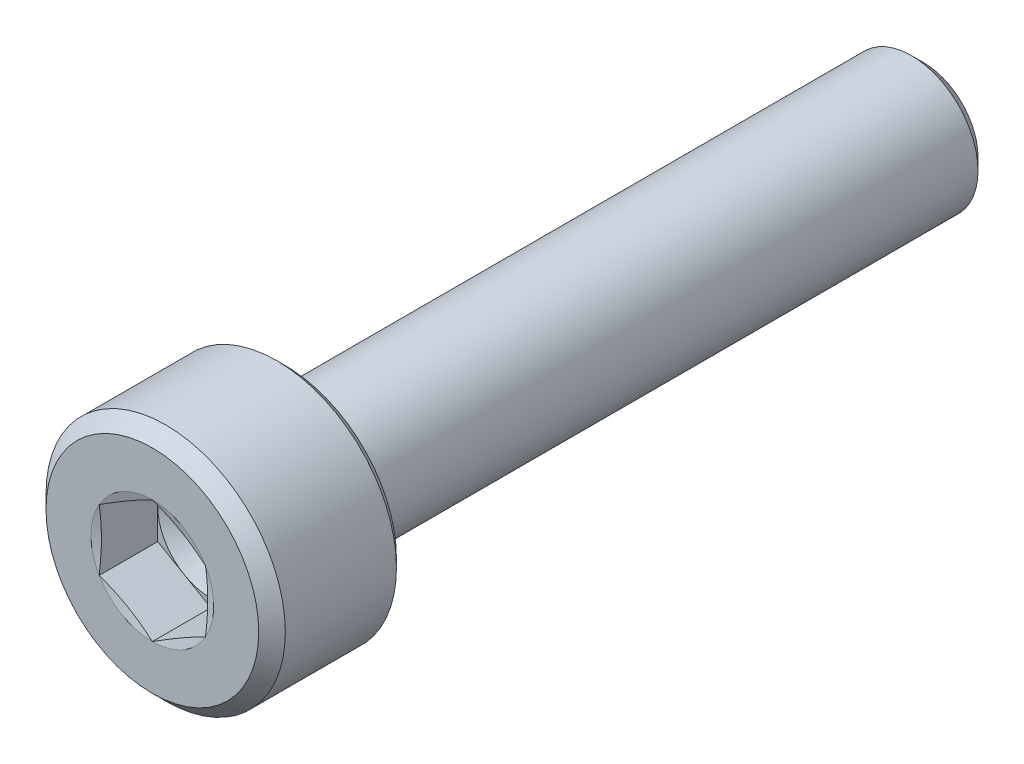
ISO-10303-21;
HEADER;
FILE_DESCRIPTION(('STEP AP214'),'2;1');
FILE_NAME('part.step','',(''),(''),'','','');
FILE_SCHEMA(('AUTOMOTIVE_DESIGN { 1 0 10303 214 1 1 1 1 }'));
ENDSEC;
DATA;
#1=APPLICATION_CONTEXT('core data for automotive mechanical design processes');
#2=APPLICATION_PROTOCOL_DEFINITION('international standard','automotive_design',2000,#1);
#3=PRODUCT_CONTEXT('',#1,'mechanical');
#4=PRODUCT('Part','Part','',(#3));
#5=PRODUCT_RELATED_PRODUCT_CATEGORY('part','',(#4));
#6=PRODUCT_DEFINITION_FORMATION('','',#4);
#7=PRODUCT_DEFINITION_CONTEXT('part definition',#1,'design');
#8=PRODUCT_DEFINITION('design','',#6,#7);
#9=PRODUCT_DEFINITION_SHAPE('','',#8);
#10=(LENGTH_UNIT() NAMED_UNIT(*) SI_UNIT(.MILLI.,.METRE.));
#11=(NAMED_UNIT(*) PLANE_ANGLE_UNIT() SI_UNIT($,.RADIAN.));
#12=(NAMED_UNIT(*) SI_UNIT($,.STERADIAN.) SOLID_ANGLE_UNIT());
#13=UNCERTAINTY_MEASURE_WITH_UNIT(LENGTH_MEASURE(1.E-05),#10,'distance_accuracy_value','');
#14=(GEOMETRIC_REPRESENTATION_CONTEXT(3) GLOBAL_UNCERTAINTY_ASSIGNED_CONTEXT((#13)) GLOBAL_UNIT_ASSIGNED_CONTEXT((#10,
#11,#12)) REPRESENTATION_CONTEXT('',''));
#15=CARTESIAN_POINT('',(0.,0.,0.));
#16=DIRECTION('',(0.,0.,1.));
#17=DIRECTION('',(1.,0.,0.));
#18=AXIS2_PLACEMENT_3D('',#15,#16,#17);
#19=CARTESIAN_POINT('',(1.,0.577350269189623,-1.1));
#20=DIRECTION('',(0.5,0.866025403784438,0.));
#21=DIRECTION('',(0.,0.,-1.));
#22=AXIS2_PLACEMENT_3D('',#19,#20,#21);
#23=PLANE('',#22);
#24=CARTESIAN_POINT('',(0.,1.15470053837925,0.));
#25=CARTESIAN_POINT('',(0.0212803047279214,1.14241272939249,-0.00329241745265177));
#26=CARTESIAN_POINT('',(0.0425777746769179,1.13011236295018,-0.00643078349953681));
#27=CARTESIAN_POINT('',(0.0847910271754036,1.10573449632619,-0.012306717745934));
#28=CARTESIAN_POINT('',(0.105706095619873,1.09365736102346,-0.0150509442347379));
#29=CARTESIAN_POINT('',(0.147262958662315,1.06967045171494,-0.0201396326444969));
#30=CARTESIAN_POINT('',(0.167904199356704,1.05776085555132,-0.0224894257016117));
#31=CARTESIAN_POINT('',(0.2090314494641,1.03403845925024,-0.0267895833540997));
#32=CARTESIAN_POINT('',(0.22951715956228,1.02222576592754,-0.0287433923934596));
#33=CARTESIAN_POINT('',(0.271050038187244,0.99823691269267,-0.0323100096794019));
#34=CARTESIAN_POINT('',(0.292097430861577,0.986059551213984,-0.0339121856374505));
#35=CARTESIAN_POINT('',(0.33391324065828,0.961869542302314,-0.0366527589892071));
#36=CARTESIAN_POINT('',(0.354681324156979,0.949857040401968,-0.0377974852662552));
#37=CARTESIAN_POINT('',(0.396147532625921,0.925907706505564,-0.0396254531503181));
#38=CARTESIAN_POINT('',(0.416845510675257,0.913970789362484,-0.0403108981397554));
#39=CARTESIAN_POINT('',(0.45836612322352,0.890037691108394,-0.0412252622174316));
#40=CARTESIAN_POINT('',(0.479188828000521,0.878041537568898,-0.0414516993027683));
#41=CARTESIAN_POINT('',(0.52080042235521,0.854015476722193,-0.0414520692564192));
#42=CARTESIAN_POINT('',(0.541589323843927,0.841985590050541,-0.0412262357974002));
#43=CARTESIAN_POINT('',(0.583061826640401,0.818002583750555,-0.0403126675459387));
#44=CARTESIAN_POINT('',(0.603745431684955,0.806049382327598,-0.0396272615859778));
#45=CARTESIAN_POINT('',(0.645220377986239,0.782115689163139,-0.037799222520247));
#46=CARTESIAN_POINT('',(0.666011719443034,0.770135379398106,-0.0366542272539497));
#47=CARTESIAN_POINT('',(0.707883346242603,0.746008609320239,-0.0339131318689071));
#48=CARTESIAN_POINT('',(0.728963313167904,0.73386233761289,-0.03231055467194));
#49=CARTESIAN_POINT('',(0.770508892512146,0.709882310092486,-0.0287442295701147));
#50=CARTESIAN_POINT('',(0.790975699548084,0.698048987794017,-0.0267914234385445));
#51=CARTESIAN_POINT('',(0.832075621183342,0.674295918511411,-0.0224925479807819));
#52=CARTESIAN_POINT('',(0.852708499488001,0.662376399208076,-0.0201429690511902));
#53=CARTESIAN_POINT('',(0.894260528709588,0.638381856883221,-0.0150542352798281));
#54=CARTESIAN_POINT('',(0.915179246526764,0.626307234659299,-0.0123096855297108));
#55=CARTESIAN_POINT('',(0.957405669765832,0.601935497779086,-0.00643257262770737));
#56=CARTESIAN_POINT('',(0.97871269290858,0.589638818121481,-0.00329328896789549));
#57=CARTESIAN_POINT('',(0.999999999999999,0.577350269189623,0.));
#58=B_SPLINE_CURVE_WITH_KNOTS('',3,(#24,#25,#26,#27,#28,#29,#30,#31,#32,#33,#34,#35,#36,#37,#38,
#39,#40,#41,#42,#43,#44,#45,#46,#47,#48,#49,#50,#51,#52,#53,#54,#55,#56,#57),.UNSPECIFIED.,.F.,
.F.,(4,2,2,2,2,2,2,2,2,2,2,2,2,2,2,2,4),(0.,0.074378565656132,0.147297091914031,
0.21913282479329,0.290314000196257,0.363417217240709,0.4354707758166,0.507176137072492,
0.57926820888535,0.651323042808546,0.72301547895146,0.795081211570477,0.868222420231763,
0.939385241523423,1.01121409584281,1.08413840789029,1.15853645507389),.UNSPECIFIED.);
#59=CARTESIAN_POINT('',(0.,1.15470053837925,0.));
#60=VERTEX_POINT('',#59);
#61=CARTESIAN_POINT('',(1.,0.577350269189622,0.));
#62=VERTEX_POINT('',#61);
#63=EDGE_CURVE('E188',#60,#62,#58,.T.);
#64=ORIENTED_EDGE('',*,*,#63,.F.);
#65=DIRECTION('',(0.,0.,1.));
#66=VECTOR('',#65,1.);
#67=CARTESIAN_POINT('',(0.,1.15470053837925,-1.1));
#68=LINE('',#67,#66);
#69=CARTESIAN_POINT('',(0.,1.15470053837925,-1.1));
#70=VERTEX_POINT('',#69);
#71=EDGE_CURVE('E290',#70,#60,#68,.T.);
#72=ORIENTED_EDGE('',*,*,#71,.F.);
#73=DIRECTION('',(-0.866025403784439,0.5,0.));
#74=VECTOR('',#73,1.);
#75=CARTESIAN_POINT('',(1.,0.577350269189623,-1.1));
#76=LINE('',#75,#74);
#77=CARTESIAN_POINT('',(0.5,0.866025403784439,-1.1));
#78=VERTEX_POINT('',#77);
#79=EDGE_CURVE('E492',#78,#70,#76,.T.);
#80=ORIENTED_EDGE('',*,*,#79,.F.);
#81=DIRECTION('',(-0.866025403784439,0.5,0.));
#82=VECTOR('',#81,1.);
#83=CARTESIAN_POINT('',(1.,0.577350269189623,-1.1));
#84=LINE('',#83,#82);
#85=CARTESIAN_POINT('',(1.,0.577350269189623,-1.1));
#86=VERTEX_POINT('',#85);
#87=EDGE_CURVE('E486',#86,#78,#84,.T.);
#88=ORIENTED_EDGE('',*,*,#87,.F.);
#89=DIRECTION('',(0.,0.,1.));
#90=VECTOR('',#89,1.);
#91=CARTESIAN_POINT('',(1.,0.577350269189623,-1.1));
#92=LINE('',#91,#90);
#93=EDGE_CURVE('E11',#86,#62,#92,.T.);
#94=ORIENTED_EDGE('',*,*,#93,.T.);
#95=EDGE_LOOP('',(#64,#72,#80,#88,#94));
#96=FACE_BOUND('',#95,.T.);
#97=ADVANCED_FACE('F17',(#96),#23,.F.);
#98=CARTESIAN_POINT('',(1.,-0.577350269189629,-1.1));
#99=DIRECTION('',(1.,0.,0.));
#100=DIRECTION('',(0.,1.,0.));
#101=AXIS2_PLACEMENT_3D('',#98,#99,#100);
#102=PLANE('',#101);
#103=CARTESIAN_POINT('',(0.999999999999999,0.577350269189623,0.));
#104=CARTESIAN_POINT('',(0.999998589586008,0.552799952611719,-0.00328935372366872));
#105=CARTESIAN_POINT('',(0.999994749104044,0.528228536388514,-0.00642497753681762));
#106=CARTESIAN_POINT('',(0.999989118284213,0.479527962312641,-0.0122960937754941));
#107=CARTESIAN_POINT('',(0.999987289132288,0.455399604863614,-0.0150382397423195));
#108=CARTESIAN_POINT('',(0.999991970443726,0.407463824405568,-0.0201234420650995));
#109=CARTESIAN_POINT('',(0.999998357174352,0.383656970380161,-0.0224718314199044));
#110=CARTESIAN_POINT('',(1.00001786940458,0.336227050276059,-0.0267697973404859));
#111=CARTESIAN_POINT('',(1.00003093264715,0.312604298008767,-0.028722829679067));
#112=CARTESIAN_POINT('',(1.00002298897659,0.264637637653127,-0.0322927974684898));
#113=CARTESIAN_POINT('',(1.00000097320745,0.240292867911121,-0.0338982165649104));
#114=CARTESIAN_POINT('',(0.999959017329225,0.191931019822148,-0.0366444430099204));
#115=CARTESIAN_POINT('',(0.999939051754846,0.167914307658478,-0.0377916488281734));
#116=CARTESIAN_POINT('',(0.999931712011933,0.119982297920335,-0.0396226587969555));
#117=CARTESIAN_POINT('',(0.999944176861574,0.0960670874179364,-0.0403087306798428));
#118=CARTESIAN_POINT('',(0.9999746805718,0.0481012791459446,-0.0412262321002332));
#119=CARTESIAN_POINT('',(0.999992748596626,0.0240506349976303,-0.0414552351279078));
#120=CARTESIAN_POINT('',(1.,0.,-0.0414518843273787));
#121=B_SPLINE_CURVE_WITH_KNOTS('',3,(#103,#104,#105,#106,#107,#108,#109,#110,#111,#112,#113,
#114,#115,#116,#117,#118,#119,#120),.UNSPECIFIED.,.F.,.F.,(4,2,2,2,2,2,2,2,4),(0.,
0.0743093348907666,0.14715803659982,0.218922360440568,0.29002938546669,0.363218592610086,
0.435346707039917,0.507117467619467,0.579268245550035),.UNSPECIFIED.);
#122=CARTESIAN_POINT('',(1.,0.,-0.0414518843273787));
#123=VERTEX_POINT('',#122);
#124=EDGE_CURVE('E337',#62,#123,#121,.T.);
#125=ORIENTED_EDGE('',*,*,#124,.F.);
#126=ORIENTED_EDGE('',*,*,#93,.F.);
#127=DIRECTION('',(0.,1.,0.));
#128=VECTOR('',#127,1.);
#129=CARTESIAN_POINT('',(1.,-0.577350269189629,-1.1));
#130=LINE('',#129,#128);
#131=CARTESIAN_POINT('',(1.,0.,-1.1));
#132=VERTEX_POINT('',#131);
#133=EDGE_CURVE('E482',#132,#86,#130,.T.);
#134=ORIENTED_EDGE('',*,*,#133,.F.);
#135=DIRECTION('',(0.,1.,0.));
#136=VECTOR('',#135,1.);
#137=CARTESIAN_POINT('',(1.,-0.577350269189629,-1.1));
#138=LINE('',#137,#136);
#139=CARTESIAN_POINT('',(1.,-0.577350269189629,-1.1));
#140=VERTEX_POINT('',#139);
#141=EDGE_CURVE('E472',#140,#132,#138,.T.);
#142=ORIENTED_EDGE('',*,*,#141,.F.);
#143=DIRECTION('',(0.,0.,1.));
#144=VECTOR('',#143,1.);
#145=CARTESIAN_POINT('',(1.,-0.577350269189629,-1.1));
#146=LINE('',#145,#144);
#147=CARTESIAN_POINT('',(1.,-0.577350269189634,0.));
#148=VERTEX_POINT('',#147);
#149=EDGE_CURVE('E31',#140,#148,#146,.T.);
#150=ORIENTED_EDGE('',*,*,#149,.T.);
#151=CARTESIAN_POINT('',(1.,0.,-0.0414518843273787));
#152=CARTESIAN_POINT('',(0.999992781583127,-0.0240310593864348,-0.0414552222406448));
#153=CARTESIAN_POINT('',(0.999975478082186,-0.0480621244212096,-0.0412263964294614));
#154=CARTESIAN_POINT('',(0.99994703979495,-0.0959932495512188,-0.0403097639562942));
#155=CARTESIAN_POINT('',(0.999935874084441,-0.119893354359502,-0.039624297415163));
#156=CARTESIAN_POINT('',(0.999945469375447,-0.167799296522528,-0.0377949885936896));
#157=CARTESIAN_POINT('',(0.999966395241438,-0.191805043869966,-0.0366488018054281));
#158=CARTESIAN_POINT('',(1.00000860791608,-0.240148816873591,-0.0339052053302966));
#159=CARTESIAN_POINT('',(1.00002989546331,-0.264486473137662,-0.0323013368937622));
#160=CARTESIAN_POINT('',(1.00003571891419,-0.312457777621816,-0.0287333914445933));
#161=CARTESIAN_POINT('',(1.00002125592585,-0.336092263301434,-0.0267805155354101));
#162=CARTESIAN_POINT('',(0.999999848866166,-0.383546369575856,-0.022482147935444));
#163=CARTESIAN_POINT('',(0.999992975750128,-0.407365674998585,-0.0201331839594352));
#164=CARTESIAN_POINT('',(0.999987618940258,-0.455327472624944,-0.0150462425278906));
#165=CARTESIAN_POINT('',(0.999989263932725,-0.479469393623761,-0.0123029103248755));
#166=CARTESIAN_POINT('',(0.999994710990349,-0.528198544172342,-0.00642881301713292));
#167=CARTESIAN_POINT('',(0.999998555750333,-0.552784970279142,-0.00329136854535415));
#168=CARTESIAN_POINT('',(0.999999999999993,-0.577350269189632,0.));
#169=B_SPLINE_CURVE_WITH_KNOTS('',3,(#151,#152,#153,#154,#155,#156,#157,#158,#159,#160,#161,
#162,#163,#164,#165,#166,#167,#168),.UNSPECIFIED.,.F.,.F.,(4,2,2,2,2,2,2,2,4),(0.,
0.0720920468109094,0.143817460801914,0.215912586974372,0.289080200876499,0.360222262390571,
0.43202392124291,0.504913450532629,0.579268138095023),.UNSPECIFIED.);
#170=EDGE_CURVE('E365',#123,#148,#169,.T.);
#171=ORIENTED_EDGE('',*,*,#170,.F.);
#172=EDGE_LOOP('',(#125,#126,#134,#142,#150,#171));
#173=FACE_BOUND('',#172,.T.);
#174=ADVANCED_FACE('F301',(#173),#102,.F.);
#175=CARTESIAN_POINT('',(0.,-1.15470053837925,-1.1));
#176=DIRECTION('',(0.5,-0.866025403784439,0.));
#177=DIRECTION('',(0.,0.,-1.));
#178=AXIS2_PLACEMENT_3D('',#175,#176,#177);
#179=PLANE('',#178);
#180=CARTESIAN_POINT('',(0.999999999999993,-0.577350269189632,0.));
#181=CARTESIAN_POINT('',(0.978718292896574,-0.589635649190956,-0.00329241745266367));
#182=CARTESIAN_POINT('',(0.957417128107096,-0.601929615982005,-0.00643078349956148));
#183=CARTESIAN_POINT('',(0.915198650071293,-0.626298431710102,-0.0123067177459751));
#184=CARTESIAN_POINT('',(0.894282009871928,-0.638372844653543,-0.0150509442347835));
#185=CARTESIAN_POINT('',(0.852730305531245,-0.662368689095608,-0.0201396326445427));
#186=CARTESIAN_POINT('',(0.832095672357568,-0.674289729820749,-0.0224894257016542));
#187=CARTESIAN_POINT('',(0.790987849468599,-0.698045775050965,-0.0267895833541251));
#188=CARTESIAN_POINT('',(0.770514901915022,-0.709880573749181,-0.0287433923934721));
#189=CARTESIAN_POINT('',(0.728973506293632,-0.73385467511324,-0.0323100096793899));
#190=CARTESIAN_POINT('',(0.707903905564922,-0.745993571113299,-0.0339121856374262));
#191=CARTESIAN_POINT('',(0.666046838431376,-0.770112120221235,-0.0366527589891678));
#192=CARTESIAN_POINT('',(0.645259664873338,-0.782091557168855,-0.0377974852662124));
#193=CARTESIAN_POINT('',(0.603785829080867,-0.80602768015339,-0.0396254531502747));
#194=CARTESIAN_POINT('',(0.583099166567404,-0.817984196379555,-0.0403108981397142));
#195=CARTESIAN_POINT('',(0.541612189213878,-0.841975552499987,-0.0412252622174069));
#196=CARTESIAN_POINT('',(0.520811863112409,-0.854010467042607,-0.0414516993027574));
#197=CARTESIAN_POINT('',(0.479198886889142,-0.878034134422194,-0.0414520692564273));
#198=CARTESIAN_POINT('',(0.458386248682745,-0.890022907892193,-0.0412262357974203));
#199=CARTESIAN_POINT('',(0.41688010456997,-0.913947645722267,-0.0403126675459755));
#200=CARTESIAN_POINT('',(0.396186525958971,-0.925883572421192,-0.0396272615860156));
#201=CARTESIAN_POINT('',(0.354721866521563,-0.949835082956523,-0.0377992225202833));
#202=CARTESIAN_POINT('',(0.333950943191367,-0.961850757954427,-0.0366542272539794));
#203=CARTESIAN_POINT('',(0.292120733992518,-0.986049265421909,-0.0339131318689258));
#204=CARTESIAN_POINT('',(0.271061770669739,-0.998231916436607,-0.0323105546719505));
#205=CARTESIAN_POINT('',(0.229521667981327,-1.02222142980346,-0.0287442295701371));
#206=CARTESIAN_POINT('',(0.209040306741839,-1.03402954348157,-0.0267914234385952));
#207=CARTESIAN_POINT('',(0.167919584507806,-1.0577465850698,-0.0224925479808691));
#208=CARTESIAN_POINT('',(0.147280538837951,-1.06965542218314,-0.0201429690512835));
#209=CARTESIAN_POINT('',(0.105724641021678,-1.09364326390542,-0.0150542352799205));
#210=CARTESIAN_POINT('',(0.084808352526039,-1.10572209383778,-0.0123096855297942));
#211=CARTESIAN_POINT('',(0.0425885976337042,-1.13010538063381,-0.00643257262775761));
#212=CARTESIAN_POINT('',(0.0212858490964939,-1.14240946412576,-0.00329328896791989));
#213=CARTESIAN_POINT('',(0.,-1.15470053837925,0.));
#214=B_SPLINE_CURVE_WITH_KNOTS('',3,(#180,#181,#182,#183,#184,#185,#186,#187,#188,#189,#190,
#191,#192,#193,#194,#195,#196,#197,#198,#199,#200,#201,#202,#203,#204,#205,#206,#207,#208,#209,
#210,#211,#212,#213),.UNSPECIFIED.,.F.,.F.,(4,2,2,2,2,2,2,2,2,2,2,2,2,2,2,2,4),(0.,
0.0743785656564016,0.14729709191438,0.219132824793544,0.290314000196259,0.363417217240547,
0.435470775816393,0.507176137072343,0.579268208885344,0.651323042807601,0.723015478950189,
0.795081211569513,0.868222420231755,0.939385241522895,1.01121409584209,1.08413840788973,
1.15853645507388),.UNSPECIFIED.);
#215=CARTESIAN_POINT('',(0.,-1.15470053837925,0.));
#216=VERTEX_POINT('',#215);
#217=EDGE_CURVE('E173',#148,#216,#214,.T.);
#218=ORIENTED_EDGE('',*,*,#217,.F.);
#219=ORIENTED_EDGE('',*,*,#149,.F.);
#220=DIRECTION('',(0.866025403784439,0.5,0.));
#221=VECTOR('',#220,1.);
#222=CARTESIAN_POINT('',(0.,-1.15470053837925,-1.1));
#223=LINE('',#222,#221);
#224=CARTESIAN_POINT('',(0.5,-0.866025403784441,-1.1));
#225=VERTEX_POINT('',#224);
#226=EDGE_CURVE('E476',#225,#140,#223,.T.);
#227=ORIENTED_EDGE('',*,*,#226,.F.);
#228=DIRECTION('',(0.866025403784439,0.5,0.));
#229=VECTOR('',#228,1.);
#230=CARTESIAN_POINT('',(0.,-1.15470053837925,-1.1));
#231=LINE('',#230,#229);
#232=CARTESIAN_POINT('',(0.,-1.15470053837925,-1.1));
#233=VERTEX_POINT('',#232);
#234=EDGE_CURVE('E177',#233,#225,#231,.T.);
#235=ORIENTED_EDGE('',*,*,#234,.F.);
#236=DIRECTION('',(0.,0.,1.));
#237=VECTOR('',#236,1.);
#238=CARTESIAN_POINT('',(0.,-1.15470053837925,-1.1));
#239=LINE('',#238,#237);
#240=EDGE_CURVE('E135',#233,#216,#239,.T.);
#241=ORIENTED_EDGE('',*,*,#240,.T.);
#242=EDGE_LOOP('',(#218,#219,#227,#235,#241));
#243=FACE_BOUND('',#242,.T.);
#244=ADVANCED_FACE('F19',(#243),#179,.F.);
#245=CARTESIAN_POINT('',(-1.,-0.577350269189628,-1.1));
#246=DIRECTION('',(-0.5,-0.866025403784439,0.));
#247=DIRECTION('',(-0.866025403784439,0.5,0.));
#248=AXIS2_PLACEMENT_3D('',#245,#246,#247);
#249=PLANE('',#248);
#250=CARTESIAN_POINT('',(0.,-1.15470053837925,0.));
#251=CARTESIAN_POINT('',(-0.02128030472802,-1.14241272939245,-0.00329241745266477));
#252=CARTESIAN_POINT('',(-0.0425777746770957,-1.13011236295008,-0.00643078349956369));
#253=CARTESIAN_POINT('',(-0.0847910271756784,-1.105734496326,-0.0123067177459787));
#254=CARTESIAN_POINT('',(-0.105706095620165,-1.09365736102325,-0.0150509442347875));
#255=CARTESIAN_POINT('',(-0.147262958662593,-1.06967045171471,-0.0201396326445469));
#256=CARTESIAN_POINT('',(-0.167904199356949,-1.0577608555511,-0.0224894257016582));
#257=CARTESIAN_POINT('',(-0.209031449464245,-1.0340384592501,-0.026789583354127));
#258=CARTESIAN_POINT('',(-0.229517159562358,-1.02222576592747,-0.0287433923934721));
#259=CARTESIAN_POINT('',(-0.27105003818735,-0.998236912692646,-0.0323100096794013));
#260=CARTESIAN_POINT('',(-0.292097430861778,-0.986059551213935,-0.0339121856374484));
#261=CARTESIAN_POINT('',(-0.333913240658599,-0.961869542302219,-0.0366527589892034));
#262=CARTESIAN_POINT('',(-0.354681324157322,-0.949857040401852,-0.0377974852662524));
#263=CARTESIAN_POINT('',(-0.396147532626253,-0.925907706505431,-0.0396254531503158));
#264=CARTESIAN_POINT('',(-0.416845510675554,-0.913970789362354,-0.0403108981397538));
#265=CARTESIAN_POINT('',(-0.458366123223697,-0.890037691108311,-0.0412252622174291));
#266=CARTESIAN_POINT('',(-0.479188828000613,-0.878041537568857,-0.0414516993027655));
#267=CARTESIAN_POINT('',(-0.52080042235529,-0.854015476722147,-0.041452069256419));
#268=CARTESIAN_POINT('',(-0.541589323844081,-0.841985590050446,-0.0412262357973997));
#269=CARTESIAN_POINT('',(-0.583061826640646,-0.818002583750387,-0.0403126675459373));
#270=CARTESIAN_POINT('',(-0.603745431685219,-0.806049382327405,-0.0396272615859772));
#271=CARTESIAN_POINT('',(-0.645220377986493,-0.782115689162929,-0.0377992225202469));
#272=CARTESIAN_POINT('',(-0.66601171944326,-0.770135379397905,-0.0366542272539504));
#273=CARTESIAN_POINT('',(-0.707883346242736,-0.746008609320114,-0.0339131318689064));
#274=CARTESIAN_POINT('',(-0.728963313167973,-0.733862337612829,-0.032310554671938));
#275=CARTESIAN_POINT('',(-0.770508892512237,-0.709882310092467,-0.0287442295701007));
#276=CARTESIAN_POINT('',(-0.79097569954826,-0.698048987793975,-0.026791423438517));
#277=CARTESIAN_POINT('',(-0.832075621183628,-0.674295918511325,-0.0224925479807371));
#278=CARTESIAN_POINT('',(-0.852708499488312,-0.662376399207968,-0.0201429690511423));
#279=CARTESIAN_POINT('',(-0.894260528709894,-0.638381856883094,-0.015054235279781));
#280=CARTESIAN_POINT('',(-0.915179246527041,-0.626307234659175,-0.0123096855296685));
#281=CARTESIAN_POINT('',(-0.957405669765996,-0.601935497779001,-0.00643257262768193));
#282=CARTESIAN_POINT('',(-0.978712692908662,-0.589638818121432,-0.00329328896788314));
#283=CARTESIAN_POINT('',(-1.,-0.577350269189618,0.));
#284=B_SPLINE_CURVE_WITH_KNOTS('',3,(#250,#251,#252,#253,#254,#255,#256,#257,#258,#259,#260,
#261,#262,#263,#264,#265,#266,#267,#268,#269,#270,#271,#272,#273,#274,#275,#276,#277,#278,#279,
#280,#281,#282,#283),.UNSPECIFIED.,.F.,.F.,(4,2,2,2,2,2,2,2,2,2,2,2,2,2,2,2,4),(0.,
0.0743785656564252,0.14729709191441,0.219132824793565,0.290314000196254,0.363417217240988,
0.435470775816973,0.507176137072769,0.579268208885341,0.651323042808801,0.723015478951801,
0.79508121157073,0.868222420231752,0.939385241523671,1.01121409584316,1.08413840789055,
1.15853645507388),.UNSPECIFIED.);
#285=CARTESIAN_POINT('',(-1.,-0.577350269189619,0.));
#286=VERTEX_POINT('',#285);
#287=EDGE_CURVE('E189',#216,#286,#284,.T.);
#288=ORIENTED_EDGE('',*,*,#287,.F.);
#289=ORIENTED_EDGE('',*,*,#240,.F.);
#290=DIRECTION('',(0.866025403784439,-0.5,0.));
#291=VECTOR('',#290,1.);
#292=CARTESIAN_POINT('',(-1.,-0.577350269189628,-1.1));
#293=LINE('',#292,#291);
#294=CARTESIAN_POINT('',(-0.5,-0.866025403784439,-1.1));
#295=VERTEX_POINT('',#294);
#296=EDGE_CURVE('E475',#295,#233,#293,.T.);
#297=ORIENTED_EDGE('',*,*,#296,.F.);
#298=DIRECTION('',(0.866025403784439,-0.5,0.));
#299=VECTOR('',#298,1.);
#300=CARTESIAN_POINT('',(-1.,-0.577350269189628,-1.1));
#301=LINE('',#300,#299);
#302=CARTESIAN_POINT('',(-1.,-0.577350269189628,-1.1));
#303=VERTEX_POINT('',#302);
#304=EDGE_CURVE('E489',#303,#295,#301,.T.);
#305=ORIENTED_EDGE('',*,*,#304,.F.);
#306=DIRECTION('',(0.,0.,1.));
#307=VECTOR('',#306,1.);
#308=CARTESIAN_POINT('',(-1.,-0.577350269189628,-1.1));
#309=LINE('',#308,#307);
#310=EDGE_CURVE('E122',#303,#286,#309,.T.);
#311=ORIENTED_EDGE('',*,*,#310,.T.);
#312=EDGE_LOOP('',(#288,#289,#297,#305,#311));
#313=FACE_BOUND('',#312,.T.);
#314=ADVANCED_FACE('F194',(#313),#249,.F.);
#315=CARTESIAN_POINT('',(-1.,0.577350269189624,-1.1));
#316=DIRECTION('',(-1.,0.,0.));
#317=DIRECTION('',(0.,0.,1.));
#318=AXIS2_PLACEMENT_3D('',#315,#316,#317);
#319=PLANE('',#318);
#320=CARTESIAN_POINT('',(-1.,-0.577350269189618,0.));
#321=CARTESIAN_POINT('',(-0.999998580684674,-0.552746412989965,-0.00329653156691863));
#322=CARTESIAN_POINT('',(-0.999995166636246,-0.528121349447135,-0.00643855466863026));
#323=CARTESIAN_POINT('',(-0.999990825986264,-0.479312939578349,-0.0123208529510736));
#324=CARTESIAN_POINT('',(-0.999989851944735,-0.455130395015993,-0.0150677950623421));
#325=CARTESIAN_POINT('',(-0.999996268645731,-0.407084921476524,-0.0201609709592123));
#326=CARTESIAN_POINT('',(-1.00000353576847,-0.38322256076547,-0.0225125348532718));
#327=CARTESIAN_POINT('',(-1.00002408622258,-0.335679409061468,-0.0268152838456018));
#328=CARTESIAN_POINT('',(-1.00003731451309,-0.311998929208056,-0.0287698997136774));
#329=CARTESIAN_POINT('',(-1.00002884301173,-0.263947228777142,-0.0323387524574676));
#330=CARTESIAN_POINT('',(-1.00000615758308,-0.239575184632073,-0.0339419606016234));
#331=CARTESIAN_POINT('',(-0.999963582704064,-0.191158386272539,-0.0366823606210567));
#332=CARTESIAN_POINT('',(-0.999943657556615,-0.167113997300416,-0.0378259579465358));
#333=CARTESIAN_POINT('',(-0.999934646191102,-0.119125267585322,-0.0396494475751657));
#334=CARTESIAN_POINT('',(-0.999945409653221,-0.0951810125314725,-0.0403315799600627));
#335=CARTESIAN_POINT('',(-0.999978429316804,-0.0471547853966321,-0.0412371318944912));
#336=CARTESIAN_POINT('',(-1.00000074714698,-0.0230727666046235,-0.0414580593469241));
#337=CARTESIAN_POINT('',(-0.999999255406937,0.0250088305365453,-0.0414454579847921));
#338=CARTESIAN_POINT('',(-0.999975603249579,0.0490084093054402,-0.041213480020573));
#339=CARTESIAN_POINT('',(-0.999941965845092,0.0968788907676935,-0.0402885121199786));
#340=CARTESIAN_POINT('',(-0.999931912965034,0.120749837764723,-0.0395978292371139));
#341=CARTESIAN_POINT('',(-0.999941910829557,0.168598822876845,-0.0377600904512283));
#342=CARTESIAN_POINT('',(-0.999962118985087,0.19257676958079,-0.0366106711589734));
#343=CARTESIAN_POINT('',(-1.00000315686578,0.240865338298915,-0.0338615590979493));
#344=CARTESIAN_POINT('',(-1.0000239913661,0.265175589997491,-0.032255408263039));
#345=CARTESIAN_POINT('',(-1.00002944879949,0.313061865863525,-0.0286863169505282));
#346=CARTESIAN_POINT('',(-1.00001510291975,0.336638765205153,-0.0267350558125644));
#347=CARTESIAN_POINT('',(-0.999994693403804,0.383979904308228,-0.0224414974525159));
#348=CARTESIAN_POINT('',(-0.999988708739569,0.407743826257856,-0.0200957030674512));
#349=CARTESIAN_POINT('',(-0.999985085304127,0.455596163631806,-0.0150167268307108));
#350=CARTESIAN_POINT('',(-0.999987575067856,0.479684007162568,-0.0122781877434789));
#351=CARTESIAN_POINT('',(-0.999994294737019,0.528305531543005,-0.00641526066629965));
#352=CARTESIAN_POINT('',(-0.999998558712517,0.55283841032926,-0.00328420685559668));
#353=CARTESIAN_POINT('',(-1.,0.577350269189625,0.));
#354=B_SPLINE_CURVE_WITH_KNOTS('',3,(#320,#321,#322,#323,#324,#325,#326,#327,#328,#329,#330,
#331,#332,#333,#334,#335,#336,#337,#338,#339,#340,#341,#342,#343,#344,#345,#346,#347,#348,#349,
#350,#351,#352,#353),.UNSPECIFIED.,.F.,.F.,(4,2,2,2,2,2,2,2,2,2,2,2,2,2,2,2,4),(0.,
0.0744713918009039,0.147483221610357,0.219414175630185,0.290694166444119,0.363964560264525,
0.436175102361938,0.508032549270057,0.580277279685217,0.652275061684219,0.723913446164234,
0.795925773772139,0.869011807577899,0.939981324692486,1.01161672110829,1.08434345073318,
1.15853638271995),.UNSPECIFIED.);
#355=CARTESIAN_POINT('',(-1.,0.577350269189624,0.));
#356=VERTEX_POINT('',#355);
#357=EDGE_CURVE('E199',#286,#356,#354,.T.);
#358=ORIENTED_EDGE('',*,*,#357,.F.);
#359=ORIENTED_EDGE('',*,*,#310,.F.);
#360=DIRECTION('',(0.,-1.,0.));
#361=VECTOR('',#360,1.);
#362=CARTESIAN_POINT('',(-1.,0.577350269189624,-1.1));
#363=LINE('',#362,#361);
#364=CARTESIAN_POINT('',(-1.,0.,-1.1));
#365=VERTEX_POINT('',#364);
#366=EDGE_CURVE('E478',#365,#303,#363,.T.);
#367=ORIENTED_EDGE('',*,*,#366,.F.);
#368=DIRECTION('',(0.,-1.,0.));
#369=VECTOR('',#368,1.);
#370=CARTESIAN_POINT('',(-1.,0.577350269189624,-1.1));
#371=LINE('',#370,#369);
#372=CARTESIAN_POINT('',(-1.,0.577350269189624,-1.1));
#373=VERTEX_POINT('',#372);
#374=EDGE_CURVE('E440',#373,#365,#371,.T.);
#375=ORIENTED_EDGE('',*,*,#374,.F.);
#376=DIRECTION('',(0.,0.,1.));
#377=VECTOR('',#376,1.);
#378=CARTESIAN_POINT('',(-1.,0.577350269189624,-1.1));
#379=LINE('',#378,#377);
#380=EDGE_CURVE('E46',#373,#356,#379,.T.);
#381=ORIENTED_EDGE('',*,*,#380,.T.);
#382=EDGE_LOOP('',(#358,#359,#367,#375,#381));
#383=FACE_BOUND('',#382,.T.);
#384=ADVANCED_FACE('F249',(#383),#319,.F.);
#385=CARTESIAN_POINT('',(0.,1.15470053837925,-1.1));
#386=DIRECTION('',(-0.5,0.866025403784439,0.));
#387=DIRECTION('',(0.,0.,1.));
#388=AXIS2_PLACEMENT_3D('',#385,#386,#387);
#389=PLANE('',#388);
#390=CARTESIAN_POINT('',(-1.,0.577350269189625,0.));
#391=CARTESIAN_POINT('',(-0.978718292896621,0.589635649190926,-0.0032924174526569));
#392=CARTESIAN_POINT('',(-0.957417128107186,0.601929615981954,-0.00643078349954806));
#393=CARTESIAN_POINT('',(-0.915198650071441,0.626298431710029,-0.0123067177459532));
#394=CARTESIAN_POINT('',(-0.894282009872092,0.638372844653469,-0.0150509442347593));
#395=CARTESIAN_POINT('',(-0.852730305531411,0.662368689095542,-0.0201396326445183));
#396=CARTESIAN_POINT('',(-0.832095672357721,0.674289729820694,-0.0224894257016315));
#397=CARTESIAN_POINT('',(-0.790987849468696,0.698045775050932,-0.0267895833541117));
#398=CARTESIAN_POINT('',(-0.770514901915075,0.709880573749159,-0.0287433923934659));
#399=CARTESIAN_POINT('',(-0.728973506293674,0.733854675113196,-0.0323100096793901));
#400=CARTESIAN_POINT('',(-0.707903905564996,0.745993571113221,-0.0339121856374273));
#401=CARTESIAN_POINT('',(-0.666046838431498,0.770112120221119,-0.0366527589891697));
#402=CARTESIAN_POINT('',(-0.645259664873474,0.782091557168735,-0.0377974852662139));
#403=CARTESIAN_POINT('',(-0.603785829081008,0.806027680153279,-0.0396254531502761));
#404=CARTESIAN_POINT('',(-0.583099166567534,0.817984196379457,-0.0403108981397155));
#405=CARTESIAN_POINT('',(-0.541612189213962,0.841975552499928,-0.0412252622174083));
#406=CARTESIAN_POINT('',(-0.520811863112458,0.854010467042574,-0.0414516993027585));
#407=CARTESIAN_POINT('',(-0.479198886889115,0.878034134422205,-0.0414520692564284));
#408=CARTESIAN_POINT('',(-0.458386248682679,0.890022907892222,-0.0412262357974217));
#409=CARTESIAN_POINT('',(-0.41688010456985,0.913947645722316,-0.0403126675459769));
#410=CARTESIAN_POINT('',(-0.396186525958836,0.925883572421243,-0.0396272615860172));
#411=CARTESIAN_POINT('',(-0.354721866521423,0.949835082956568,-0.0377992225202851));
#412=CARTESIAN_POINT('',(-0.333950943191238,0.961850757954462,-0.0366542272539818));
#413=CARTESIAN_POINT('',(-0.292120733992441,0.986049265421924,-0.0339131318689277));
#414=CARTESIAN_POINT('',(-0.271061770669705,0.99823191643661,-0.0323105546719519));
#415=CARTESIAN_POINT('',(-0.229521667981306,1.02222142980348,-0.0287442295701328));
#416=CARTESIAN_POINT('',(-0.209040306741789,1.03402954348162,-0.0267914234385845));
#417=CARTESIAN_POINT('',(-0.167919584507713,1.05774658506989,-0.0224925479808498));
#418=CARTESIAN_POINT('',(-0.147280538837845,1.06965542218323,-0.0201429690512627));
#419=CARTESIAN_POINT('',(-0.105724641021567,1.09364326390551,-0.0150542352798998));
#420=CARTESIAN_POINT('',(-0.084808352525936,1.10572209383786,-0.0123096855297754));
#421=CARTESIAN_POINT('',(-0.042588597633646,1.13010538063386,-0.0064325726277463));
#422=CARTESIAN_POINT('',(-0.0212858490964715,1.14240946412578,-0.00329328896791445));
#423=CARTESIAN_POINT('',(0.,1.15470053837925,0.));
#424=B_SPLINE_CURVE_WITH_KNOTS('',3,(#390,#391,#392,#393,#394,#395,#396,#397,#398,#399,#400,
#401,#402,#403,#404,#405,#406,#407,#408,#409,#410,#411,#412,#413,#414,#415,#416,#417,#418,#419,
#420,#421,#422,#423),.UNSPECIFIED.,.F.,.F.,(4,2,2,2,2,2,2,2,2,2,2,2,2,2,2,2,4),(0.,
0.0743785656562587,0.147297091914194,0.219132824793408,0.290314000196255,0.363417217240408,
0.43547077581621,0.507176137072205,0.57926820888534,0.651323042807724,0.723015478950356,
0.795081211569639,0.868222420231755,0.939385241523016,1.01121409584225,1.08413840788986,
1.15853645507388),.UNSPECIFIED.);
#425=EDGE_CURVE('E213',#356,#60,#424,.T.);
#426=ORIENTED_EDGE('',*,*,#425,.F.);
#427=ORIENTED_EDGE('',*,*,#380,.F.);
#428=DIRECTION('',(-0.866025403784439,-0.5,0.));
#429=VECTOR('',#428,1.);
#430=CARTESIAN_POINT('',(0.,1.15470053837925,-1.1));
#431=LINE('',#430,#429);
#432=CARTESIAN_POINT('',(-0.5,0.866025403784439,-1.1));
#433=VERTEX_POINT('',#432);
#434=EDGE_CURVE('E453',#433,#373,#431,.T.);
#435=ORIENTED_EDGE('',*,*,#434,.F.);
#436=DIRECTION('',(-0.866025403784439,-0.5,0.));
#437=VECTOR('',#436,1.);
#438=CARTESIAN_POINT('',(0.,1.15470053837925,-1.1));
#439=LINE('',#438,#437);
#440=EDGE_CURVE('E462',#70,#433,#439,.T.);
#441=ORIENTED_EDGE('',*,*,#440,.F.);
#442=ORIENTED_EDGE('',*,*,#71,.T.);
#443=EDGE_LOOP('',(#426,#427,#435,#441,#442));
#444=FACE_BOUND('',#443,.T.);
#445=ADVANCED_FACE('F256',(#444),#389,.F.);
#446=CARTESIAN_POINT('',(0.,0.,-1.1));
#447=DIRECTION('',(0.,0.,1.));
#448=DIRECTION('',(1.,0.,0.));
#449=AXIS2_PLACEMENT_3D('',#446,#447,#448);
#450=PLANE('',#449);
#451=CARTESIAN_POINT('',(0.,0.,-1.1));
#452=DIRECTION('',(0.,0.,1.));
#453=DIRECTION('',(1.,0.,0.));
#454=AXIS2_PLACEMENT_3D('',#451,#452,#453);
#455=CIRCLE('',#454,1.);
#456=EDGE_CURVE('E498',#433,#365,#455,.T.);
#457=ORIENTED_EDGE('',*,*,#456,.F.);
#458=ORIENTED_EDGE('',*,*,#434,.T.);
#459=ORIENTED_EDGE('',*,*,#374,.T.);
#460=EDGE_LOOP('',(#457,#458,#459));
#461=FACE_BOUND('',#460,.T.);
#462=ADVANCED_FACE('F252',(#461),#450,.T.);
#463=CARTESIAN_POINT('',(0.,0.,-1.1));
#464=DIRECTION('',(0.,0.,1.));
#465=DIRECTION('',(1.,0.,0.));
#466=AXIS2_PLACEMENT_3D('',#463,#464,#465);
#467=PLANE('',#466);
#468=CARTESIAN_POINT('',(0.,0.,-1.1));
#469=DIRECTION('',(0.,0.,1.));
#470=DIRECTION('',(1.,0.,0.));
#471=AXIS2_PLACEMENT_3D('',#468,#469,#470);
#472=CIRCLE('',#471,1.);
#473=EDGE_CURVE('E506',#78,#433,#472,.T.);
#474=ORIENTED_EDGE('',*,*,#473,.F.);
#475=ORIENTED_EDGE('',*,*,#79,.T.);
#476=ORIENTED_EDGE('',*,*,#440,.T.);
#477=EDGE_LOOP('',(#474,#475,#476));
#478=FACE_BOUND('',#477,.T.);
#479=ADVANCED_FACE('F255',(#478),#467,.T.);
#480=CARTESIAN_POINT('',(0.,0.,-1.1));
#481=DIRECTION('',(0.,0.,1.));
#482=DIRECTION('',(1.,0.,0.));
#483=AXIS2_PLACEMENT_3D('',#480,#481,#482);
#484=PLANE('',#483);
#485=CARTESIAN_POINT('',(0.,0.,-1.1));
#486=DIRECTION('',(0.,0.,1.));
#487=DIRECTION('',(1.,0.,0.));
#488=AXIS2_PLACEMENT_3D('',#485,#486,#487);
#489=CIRCLE('',#488,1.);
#490=EDGE_CURVE('E493',#365,#295,#489,.T.);
#491=ORIENTED_EDGE('',*,*,#490,.F.);
#492=ORIENTED_EDGE('',*,*,#366,.T.);
#493=ORIENTED_EDGE('',*,*,#304,.T.);
#494=EDGE_LOOP('',(#491,#492,#493));
#495=FACE_BOUND('',#494,.T.);
#496=ADVANCED_FACE('F313',(#495),#484,.T.);
#497=CARTESIAN_POINT('',(0.,0.,-1.1));
#498=DIRECTION('',(0.,0.,1.));
#499=DIRECTION('',(1.,0.,0.));
#500=AXIS2_PLACEMENT_3D('',#497,#498,#499);
#501=PLANE('',#500);
#502=CARTESIAN_POINT('',(0.,0.,-1.1));
#503=DIRECTION('',(0.,0.,1.));
#504=DIRECTION('',(1.,0.,0.));
#505=AXIS2_PLACEMENT_3D('',#502,#503,#504);
#506=CIRCLE('',#505,1.);
#507=EDGE_CURVE('E497',#295,#225,#506,.T.);
#508=ORIENTED_EDGE('',*,*,#507,.F.);
#509=ORIENTED_EDGE('',*,*,#296,.T.);
#510=ORIENTED_EDGE('',*,*,#234,.T.);
#511=EDGE_LOOP('',(#508,#509,#510));
#512=FACE_BOUND('',#511,.T.);
#513=ADVANCED_FACE('F310',(#512),#501,.T.);
#514=CARTESIAN_POINT('',(0.,0.,-1.1));
#515=DIRECTION('',(0.,0.,1.));
#516=DIRECTION('',(1.,0.,0.));
#517=AXIS2_PLACEMENT_3D('',#514,#515,#516);
#518=PLANE('',#517);
#519=CARTESIAN_POINT('',(0.,0.,-1.1));
#520=DIRECTION('',(0.,0.,1.));
#521=DIRECTION('',(1.,0.,0.));
#522=AXIS2_PLACEMENT_3D('',#519,#520,#521);
#523=CIRCLE('',#522,1.);
#524=EDGE_CURVE('E507',#225,#132,#523,.T.);
#525=ORIENTED_EDGE('',*,*,#524,.F.);
#526=ORIENTED_EDGE('',*,*,#226,.T.);
#527=ORIENTED_EDGE('',*,*,#141,.T.);
#528=EDGE_LOOP('',(#525,#526,#527));
#529=FACE_BOUND('',#528,.T.);
#530=ADVANCED_FACE('F312',(#529),#518,.T.);
#531=CARTESIAN_POINT('',(0.,0.,-1.1));
#532=DIRECTION('',(0.,0.,1.));
#533=DIRECTION('',(1.,0.,0.));
#534=AXIS2_PLACEMENT_3D('',#531,#532,#533);
#535=PLANE('',#534);
#536=CARTESIAN_POINT('',(0.,0.,-1.1));
#537=DIRECTION('',(0.,0.,1.));
#538=DIRECTION('',(1.,0.,0.));
#539=AXIS2_PLACEMENT_3D('',#536,#537,#538);
#540=CIRCLE('',#539,1.);
#541=EDGE_CURVE('E502',#132,#78,#540,.T.);
#542=ORIENTED_EDGE('',*,*,#541,.F.);
#543=ORIENTED_EDGE('',*,*,#133,.T.);
#544=ORIENTED_EDGE('',*,*,#87,.T.);
#545=EDGE_LOOP('',(#542,#543,#544));
#546=FACE_BOUND('',#545,.T.);
#547=ADVANCED_FACE('F267',(#546),#535,.T.);
#548=CARTESIAN_POINT('',(0.,0.,-0.0414518843273786));
#549=DIRECTION('',(0.,0.,1.));
#550=DIRECTION('',(1.,0.,0.));
#551=AXIS2_PLACEMENT_3D('',#548,#549,#550);
#552=CONICAL_SURFACE('',#551,1.,1.30899693899575);
#553=ORIENTED_EDGE('',*,*,#63,.T.);
#554=CARTESIAN_POINT('',(0.,0.,0.));
#555=DIRECTION('',(0.,0.,1.));
#556=DIRECTION('',(1.,0.,0.));
#557=AXIS2_PLACEMENT_3D('',#554,#555,#556);
#558=CIRCLE('',#557,1.15470053837925);
#559=EDGE_CURVE('E214',#62,#60,#558,.T.);
#560=ORIENTED_EDGE('',*,*,#559,.T.);
#561=EDGE_LOOP('',(#553,#560));
#562=FACE_BOUND('',#561,.T.);
#563=ADVANCED_FACE('F263',(#562),#552,.F.);
#564=CARTESIAN_POINT('',(0.,0.,-0.0414518843273786));
#565=DIRECTION('',(0.,0.,1.));
#566=DIRECTION('',(1.,0.,0.));
#567=AXIS2_PLACEMENT_3D('',#564,#565,#566);
#568=CONICAL_SURFACE('',#567,1.,1.30899693899575);
#569=ORIENTED_EDGE('',*,*,#217,.T.);
#570=CARTESIAN_POINT('',(0.,0.,0.));
#571=DIRECTION('',(0.,0.,1.));
#572=DIRECTION('',(1.,0.,0.));
#573=AXIS2_PLACEMENT_3D('',#570,#571,#572);
#574=CIRCLE('',#573,1.15470053837925);
#575=EDGE_CURVE('E185',#216,#148,#574,.T.);
#576=ORIENTED_EDGE('',*,*,#575,.T.);
#577=EDGE_LOOP('',(#569,#576));
#578=FACE_BOUND('',#577,.T.);
#579=ADVANCED_FACE('F183',(#578),#568,.F.);
#580=CARTESIAN_POINT('',(0.,0.,-0.0414518843273786));
#581=DIRECTION('',(0.,0.,1.));
#582=DIRECTION('',(1.,0.,0.));
#583=AXIS2_PLACEMENT_3D('',#580,#581,#582);
#584=CONICAL_SURFACE('',#583,1.,1.30899693899575);
#585=ORIENTED_EDGE('',*,*,#287,.T.);
#586=CARTESIAN_POINT('',(0.,0.,0.));
#587=DIRECTION('',(0.,0.,1.));
#588=DIRECTION('',(1.,0.,0.));
#589=AXIS2_PLACEMENT_3D('',#586,#587,#588);
#590=CIRCLE('',#589,1.15470053837925);
#591=EDGE_CURVE('E207',#286,#216,#590,.T.);
#592=ORIENTED_EDGE('',*,*,#591,.T.);
#593=EDGE_LOOP('',(#585,#592));
#594=FACE_BOUND('',#593,.T.);
#595=ADVANCED_FACE('F216',(#594),#584,.F.);
#596=CARTESIAN_POINT('',(0.,0.,-0.0414518843273786));
#597=DIRECTION('',(0.,0.,1.));
#598=DIRECTION('',(1.,0.,0.));
#599=AXIS2_PLACEMENT_3D('',#596,#597,#598);
#600=CONICAL_SURFACE('',#599,1.,1.30899693899575);
#601=ORIENTED_EDGE('',*,*,#357,.T.);
#602=CARTESIAN_POINT('',(0.,0.,0.));
#603=DIRECTION('',(0.,0.,1.));
#604=DIRECTION('',(1.,0.,0.));
#605=AXIS2_PLACEMENT_3D('',#602,#603,#604);
#606=CIRCLE('',#605,1.15470053837925);
#607=EDGE_CURVE('E218',#356,#286,#606,.T.);
#608=ORIENTED_EDGE('',*,*,#607,.T.);
#609=EDGE_LOOP('',(#601,#608));
#610=FACE_BOUND('',#609,.T.);
#611=ADVANCED_FACE('F248',(#610),#600,.F.);
#612=CARTESIAN_POINT('',(0.,0.,-0.0414518843273786));
#613=DIRECTION('',(0.,0.,1.));
#614=DIRECTION('',(1.,0.,0.));
#615=AXIS2_PLACEMENT_3D('',#612,#613,#614);
#616=CONICAL_SURFACE('',#615,1.,1.30899693899575);
#617=CARTESIAN_POINT('',(0.,0.,0.));
#618=DIRECTION('',(0.,0.,1.));
#619=DIRECTION('',(1.,0.,0.));
#620=AXIS2_PLACEMENT_3D('',#617,#618,#619);
#621=CIRCLE('',#620,1.15470053837925);
#622=EDGE_CURVE('E227',#60,#356,#621,.T.);
#623=ORIENTED_EDGE('',*,*,#622,.T.);
#624=ORIENTED_EDGE('',*,*,#425,.T.);
#625=EDGE_LOOP('',(#623,#624));
#626=FACE_BOUND('',#625,.T.);
#627=ADVANCED_FACE('F410',(#626),#616,.F.);
#628=CARTESIAN_POINT('',(0.,1.025,-14.5));
#629=DIRECTION('',(0.,0.,1.));
#630=DIRECTION('',(1.,0.,0.));
#631=AXIS2_PLACEMENT_3D('',#628,#629,#630);
#632=PLANE('',#631);
#633=CARTESIAN_POINT('',(0.,0.,-14.5));
#634=DIRECTION('',(0.,0.,1.));
#635=DIRECTION('',(1.,0.,0.));
#636=AXIS2_PLACEMENT_3D('',#633,#634,#635);
#637=CIRCLE('',#636,1.025);
#638=CARTESIAN_POINT('',(-1.025,0.,-14.5));
#639=VERTEX_POINT('',#638);
#640=EDGE_CURVE('E479',#639,#639,#637,.T.);
#641=ORIENTED_EDGE('',*,*,#640,.F.);
#642=EDGE_LOOP('',(#641));
#643=FACE_BOUND('',#642,.T.);
#644=ADVANCED_FACE('F424',(#643),#632,.F.);
#645=CARTESIAN_POINT('',(0.,2.09,-2.5));
#646=DIRECTION('',(0.,0.,1.));
#647=DIRECTION('',(1.,0.,0.));
#648=AXIS2_PLACEMENT_3D('',#645,#646,#647);
#649=PLANE('',#648);
#650=CARTESIAN_POINT('',(0.,0.,-2.5));
#651=DIRECTION('',(0.,0.,1.));
#652=DIRECTION('',(1.,0.,0.));
#653=AXIS2_PLACEMENT_3D('',#650,#651,#652);
#654=CIRCLE('',#653,1.55);
#655=CARTESIAN_POINT('',(1.55,0.,-2.5));
#656=VERTEX_POINT('',#655);
#657=EDGE_CURVE('E471',#656,#656,#654,.T.);
#658=ORIENTED_EDGE('',*,*,#657,.T.);
#659=EDGE_LOOP('',(#658));
#660=FACE_BOUND('',#659,.T.);
#661=CARTESIAN_POINT('',(0.,0.,-2.5));
#662=DIRECTION('',(0.,0.,1.));
#663=DIRECTION('',(1.,0.,0.));
#664=AXIS2_PLACEMENT_3D('',#661,#662,#663);
#665=CIRCLE('',#664,2.09);
#666=CARTESIAN_POINT('',(-2.09,0.,-2.5));
#667=VERTEX_POINT('',#666);
#668=EDGE_CURVE('E468',#667,#667,#665,.T.);
#669=ORIENTED_EDGE('',*,*,#668,.F.);
#670=EDGE_LOOP('',(#669));
#671=FACE_BOUND('',#670,.T.);
#672=ADVANCED_FACE('F645',(#660,#671),#649,.F.);
#673=CARTESIAN_POINT('',(0.,0.,0.));
#674=DIRECTION('',(0.,0.,-1.));
#675=DIRECTION('',(0.,-1.,0.));
#676=AXIS2_PLACEMENT_3D('',#673,#674,#675);
#677=PLANE('',#676);
#678=ORIENTED_EDGE('',*,*,#591,.F.);
#679=ORIENTED_EDGE('',*,*,#607,.F.);
#680=ORIENTED_EDGE('',*,*,#622,.F.);
#681=ORIENTED_EDGE('',*,*,#559,.F.);
#682=CARTESIAN_POINT('',(0.,0.,0.));
#683=DIRECTION('',(0.,0.,1.));
#684=DIRECTION('',(1.,0.,0.));
#685=AXIS2_PLACEMENT_3D('',#682,#683,#684);
#686=CIRCLE('',#685,1.15470053837925);
#687=EDGE_CURVE('E210',#148,#62,#686,.T.);
#688=ORIENTED_EDGE('',*,*,#687,.F.);
#689=ORIENTED_EDGE('',*,*,#575,.F.);
#690=EDGE_LOOP('',(#678,#679,#680,#681,#688,#689));
#691=FACE_BOUND('',#690,.T.);
#692=CARTESIAN_POINT('',(0.,0.,0.));
#693=DIRECTION('',(0.,0.,1.));
#694=DIRECTION('',(1.,0.,0.));
#695=AXIS2_PLACEMENT_3D('',#692,#693,#694);
#696=CIRCLE('',#695,2.);
#697=CARTESIAN_POINT('',(-2.,0.,0.));
#698=VERTEX_POINT('',#697);
#699=EDGE_CURVE('E219',#698,#698,#696,.T.);
#700=ORIENTED_EDGE('',*,*,#699,.T.);
#701=EDGE_LOOP('',(#700));
#702=FACE_BOUND('',#701,.T.);
#703=ADVANCED_FACE('F204',(#691,#702),#677,.F.);
#704=CARTESIAN_POINT('',(0.,0.,-0.25));
#705=DIRECTION('',(0.,0.,-1.));
#706=DIRECTION('',(-1.,0.,0.));
#707=AXIS2_PLACEMENT_3D('',#704,#705,#706);
#708=CONICAL_SURFACE('',#707,2.25,0.785398163397459);
#709=CARTESIAN_POINT('',(0.,0.,-0.25));
#710=DIRECTION('',(0.,0.,1.));
#711=DIRECTION('',(1.,0.,0.));
#712=AXIS2_PLACEMENT_3D('',#709,#710,#711);
#713=CIRCLE('',#712,2.25);
#714=CARTESIAN_POINT('',(2.25,0.,-0.25));
#715=VERTEX_POINT('',#714);
#716=EDGE_CURVE('E230',#715,#715,#713,.T.);
#717=ORIENTED_EDGE('',*,*,#716,.T.);
#718=EDGE_LOOP('',(#717));
#719=FACE_BOUND('',#718,.T.);
#720=ORIENTED_EDGE('',*,*,#699,.F.);
#721=EDGE_LOOP('',(#720));
#722=FACE_BOUND('',#721,.T.);
#723=ADVANCED_FACE('F258',(#719,#722),#708,.T.);
#724=CARTESIAN_POINT('',(0.,0.,0.));
#725=DIRECTION('',(0.,0.,1.));
#726=DIRECTION('',(1.,0.,0.));
#727=AXIS2_PLACEMENT_3D('',#724,#725,#726);
#728=CYLINDRICAL_SURFACE('',#727,2.25);
#729=ORIENTED_EDGE('',*,*,#716,.F.);
#730=EDGE_LOOP('',(#729));
#731=FACE_BOUND('',#730,.T.);
#732=CARTESIAN_POINT('',(0.,0.,-2.34));
#733=DIRECTION('',(0.,0.,1.));
#734=DIRECTION('',(1.,0.,0.));
#735=AXIS2_PLACEMENT_3D('',#732,#733,#734);
#736=CIRCLE('',#735,2.25);
#737=CARTESIAN_POINT('',(2.25,0.,-2.34));
#738=VERTEX_POINT('',#737);
#739=EDGE_CURVE('E470',#738,#738,#736,.T.);
#740=ORIENTED_EDGE('',*,*,#739,.T.);
#741=EDGE_LOOP('',(#740));
#742=FACE_BOUND('',#741,.T.);
#743=ADVANCED_FACE('F261',(#731,#742),#728,.T.);
#744=CARTESIAN_POINT('',(0.,0.,-2.5));
#745=DIRECTION('',(0.,0.,1.));
#746=DIRECTION('',(1.,0.,0.));
#747=AXIS2_PLACEMENT_3D('',#744,#745,#746);
#748=CONICAL_SURFACE('',#747,2.09,0.785398163397441);
#749=ORIENTED_EDGE('',*,*,#739,.F.);
#750=EDGE_LOOP('',(#749));
#751=FACE_BOUND('',#750,.T.);
#752=ORIENTED_EDGE('',*,*,#668,.T.);
#753=EDGE_LOOP('',(#752));
#754=FACE_BOUND('',#753,.T.);
#755=ADVANCED_FACE('F416',(#751,#754),#748,.T.);
#756=CARTESIAN_POINT('',(0.,0.,-2.6));
#757=DIRECTION('',(0.,0.,1.));
#758=DIRECTION('',(1.,0.,0.));
#759=AXIS2_PLACEMENT_3D('',#756,#757,#758);
#760=TOROIDAL_SURFACE('',#759,1.55,0.100000000000001);
#761=CARTESIAN_POINT('',(0.,0.,-2.55615763679786));
#762=DIRECTION('',(0.,0.,1.));
#763=DIRECTION('',(1.,0.,0.));
#764=AXIS2_PLACEMENT_3D('',#761,#762,#763);
#765=CIRCLE('',#764,1.46012315543561);
#766=CARTESIAN_POINT('',(1.46012315543561,0.,-2.55615763679786));
#767=VERTEX_POINT('',#766);
#768=EDGE_CURVE('E514',#767,#767,#765,.T.);
#769=ORIENTED_EDGE('',*,*,#768,.T.);
#770=EDGE_LOOP('',(#769));
#771=FACE_BOUND('',#770,.T.);
#772=ORIENTED_EDGE('',*,*,#657,.F.);
#773=EDGE_LOOP('',(#772));
#774=FACE_BOUND('',#773,.T.);
#775=ADVANCED_FACE('F308',(#771,#774),#760,.F.);
#776=CARTESIAN_POINT('',(0.,0.,-2.96615763679786));
#777=DIRECTION('',(0.,0.,1.));
#778=DIRECTION('',(1.,0.,0.));
#779=AXIS2_PLACEMENT_3D('',#776,#777,#778);
#780=CONICAL_SURFACE('',#779,1.26012315543561,0.45384400152151);
#781=ORIENTED_EDGE('',*,*,#768,.F.);
#782=EDGE_LOOP('',(#781));
#783=FACE_BOUND('',#782,.T.);
#784=CARTESIAN_POINT('',(0.,0.,-2.96615763679786));
#785=DIRECTION('',(0.,0.,1.));
#786=DIRECTION('',(1.,0.,0.));
#787=AXIS2_PLACEMENT_3D('',#784,#785,#786);
#788=CIRCLE('',#787,1.26012315543561);
#789=CARTESIAN_POINT('',(1.26012315543561,0.,-2.96615763679786));
#790=VERTEX_POINT('',#789);
#791=EDGE_CURVE('E466',#790,#790,#788,.T.);
#792=ORIENTED_EDGE('',*,*,#791,.T.);
#793=EDGE_LOOP('',(#792));
#794=FACE_BOUND('',#793,.T.);
#795=ADVANCED_FACE('F304',(#783,#794),#780,.T.);
#796=CARTESIAN_POINT('',(0.,0.,-3.01));
#797=DIRECTION('',(0.,0.,1.));
#798=DIRECTION('',(1.,0.,0.));
#799=AXIS2_PLACEMENT_3D('',#796,#797,#798);
#800=TOROIDAL_SURFACE('',#799,1.35,0.1);
#801=CARTESIAN_POINT('',(0.,0.,-3.01));
#802=DIRECTION('',(0.,0.,1.));
#803=DIRECTION('',(1.,0.,0.));
#804=AXIS2_PLACEMENT_3D('',#801,#802,#803);
#805=CIRCLE('',#804,1.25);
#806=CARTESIAN_POINT('',(1.25,0.,-3.01));
#807=VERTEX_POINT('',#806);
#808=EDGE_CURVE('E517',#807,#807,#805,.T.);
#809=ORIENTED_EDGE('',*,*,#808,.T.);
#810=EDGE_LOOP('',(#809));
#811=FACE_BOUND('',#810,.T.);
#812=ORIENTED_EDGE('',*,*,#791,.F.);
#813=EDGE_LOOP('',(#812));
#814=FACE_BOUND('',#813,.T.);
#815=ADVANCED_FACE('F307',(#811,#814),#800,.F.);
#816=CARTESIAN_POINT('',(0.,0.,0.));
#817=DIRECTION('',(0.,0.,1.));
#818=DIRECTION('',(1.,0.,0.));
#819=AXIS2_PLACEMENT_3D('',#816,#817,#818);
#820=CYLINDRICAL_SURFACE('',#819,1.25);
#821=ORIENTED_EDGE('',*,*,#808,.F.);
#822=EDGE_LOOP('',(#821));
#823=FACE_BOUND('',#822,.T.);
#824=CARTESIAN_POINT('',(0.,0.,-14.275));
#825=DIRECTION('',(0.,0.,1.));
#826=DIRECTION('',(1.,0.,0.));
#827=AXIS2_PLACEMENT_3D('',#824,#825,#826);
#828=CIRCLE('',#827,1.25);
#829=CARTESIAN_POINT('',(1.25,0.,-14.275));
#830=VERTEX_POINT('',#829);
#831=EDGE_CURVE('E481',#830,#830,#828,.T.);
#832=ORIENTED_EDGE('',*,*,#831,.T.);
#833=EDGE_LOOP('',(#832));
#834=FACE_BOUND('',#833,.T.);
#835=ADVANCED_FACE('F380',(#823,#834),#820,.T.);
#836=CARTESIAN_POINT('',(0.,0.,-14.5));
#837=DIRECTION('',(0.,0.,1.));
#838=DIRECTION('',(1.,0.,0.));
#839=AXIS2_PLACEMENT_3D('',#836,#837,#838);
#840=CONICAL_SURFACE('',#839,1.025,0.785398163397438);
#841=ORIENTED_EDGE('',*,*,#831,.F.);
#842=EDGE_LOOP('',(#841));
#843=FACE_BOUND('',#842,.T.);
#844=ORIENTED_EDGE('',*,*,#640,.T.);
#845=EDGE_LOOP('',(#844));
#846=FACE_BOUND('',#845,.T.);
#847=ADVANCED_FACE('F352',(#843,#846),#840,.T.);
#848=CARTESIAN_POINT('',(0.,0.,-0.0414518843273786));
#849=DIRECTION('',(0.,0.,1.));
#850=DIRECTION('',(1.,0.,0.));
#851=AXIS2_PLACEMENT_3D('',#848,#849,#850);
#852=CONICAL_SURFACE('',#851,1.,1.30899693899575);
#853=ORIENTED_EDGE('',*,*,#124,.T.);
#854=ORIENTED_EDGE('',*,*,#170,.T.);
#855=ORIENTED_EDGE('',*,*,#687,.T.);
#856=EDGE_LOOP('',(#853,#854,#855));
#857=FACE_BOUND('',#856,.T.);
#858=ADVANCED_FACE('F341',(#857),#852,.F.);
#859=CARTESIAN_POINT('',(0.,0.,998.32264973081));
#860=DIRECTION('',(0.,0.,1.));
#861=DIRECTION('',(1.,0.,0.));
#862=AXIS2_PLACEMENT_3D('',#859,#860,#861);
#863=CONICAL_SURFACE('',#862,1732.05080756889,1.0471975511966);
#864=CARTESIAN_POINT('',(0.,0.,-1.67735026918962));
#865=VERTEX_POINT('',#864);
#866=VERTEX_LOOP('',#865);
#867=FACE_BOUND('',#866,.T.);
#868=ORIENTED_EDGE('',*,*,#456,.T.);
#869=ORIENTED_EDGE('',*,*,#490,.T.);
#870=ORIENTED_EDGE('',*,*,#507,.T.);
#871=ORIENTED_EDGE('',*,*,#524,.T.);
#872=ORIENTED_EDGE('',*,*,#541,.T.);
#873=ORIENTED_EDGE('',*,*,#473,.T.);
#874=EDGE_LOOP('',(#868,#869,#870,#871,#872,#873));
#875=FACE_BOUND('',#874,.T.);
#876=ADVANCED_FACE('F351',(#867,#875),#863,.F.);
#877=CLOSED_SHELL('',(#97,#174,#244,#314,#384,#445,#462,#479,#496,#513,#530,#547,#563,#579,#595,
#611,#627,#644,#672,#703,#723,#743,#755,#775,#795,#815,#835,#847,#858,#876));
#878=MANIFOLD_SOLID_BREP('B1',#877);
#879=ADVANCED_BREP_SHAPE_REPRESENTATION('',(#18,#878),#14);
#880=SHAPE_DEFINITION_REPRESENTATION(#9,#879);
ENDSEC;
END-ISO-10303-21;
